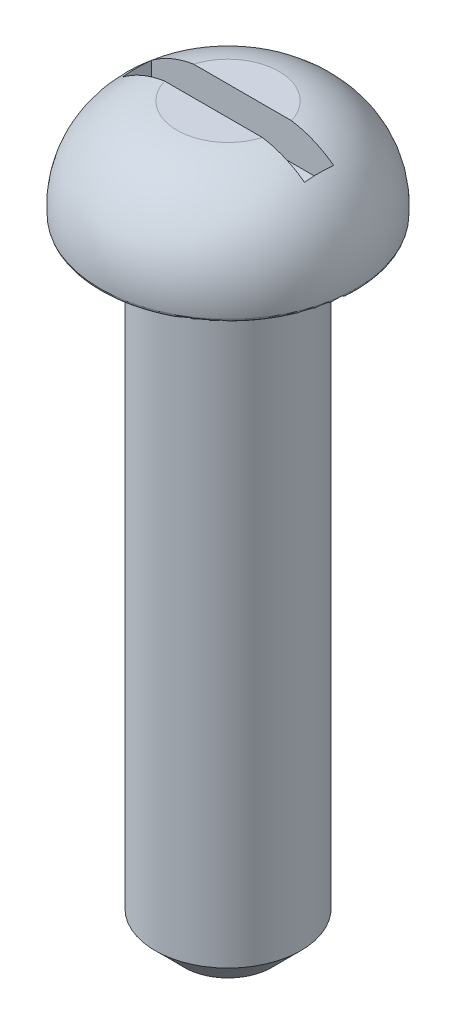
ISO-10303-21;
HEADER;
FILE_DESCRIPTION(('STEP AP214'),'2;1');
FILE_NAME('part.step','',(''),(''),'','','');
FILE_SCHEMA(('AUTOMOTIVE_DESIGN { 1 0 10303 214 1 1 1 1 }'));
ENDSEC;
DATA;
#1=APPLICATION_CONTEXT('core data for automotive mechanical design processes');
#2=APPLICATION_PROTOCOL_DEFINITION('international standard','automotive_design',2000,#1);
#3=PRODUCT_CONTEXT('',#1,'mechanical');
#4=PRODUCT('Part','Part','',(#3));
#5=PRODUCT_RELATED_PRODUCT_CATEGORY('part','',(#4));
#6=PRODUCT_DEFINITION_FORMATION('','',#4);
#7=PRODUCT_DEFINITION_CONTEXT('part definition',#1,'design');
#8=PRODUCT_DEFINITION('design','',#6,#7);
#9=PRODUCT_DEFINITION_SHAPE('','',#8);
#10=(LENGTH_UNIT() NAMED_UNIT(*) SI_UNIT(.MILLI.,.METRE.));
#11=(NAMED_UNIT(*) PLANE_ANGLE_UNIT() SI_UNIT($,.RADIAN.));
#12=(NAMED_UNIT(*) SI_UNIT($,.STERADIAN.) SOLID_ANGLE_UNIT());
#13=UNCERTAINTY_MEASURE_WITH_UNIT(LENGTH_MEASURE(1.E-05),#10,'distance_accuracy_value','');
#14=(GEOMETRIC_REPRESENTATION_CONTEXT(3) GLOBAL_UNCERTAINTY_ASSIGNED_CONTEXT((#13)) GLOBAL_UNIT_ASSIGNED_CONTEXT((#10,
#11,#12)) REPRESENTATION_CONTEXT('',''));
#15=CARTESIAN_POINT('',(0.,0.,0.));
#16=DIRECTION('',(0.,0.,1.));
#17=DIRECTION('',(1.,0.,0.));
#18=AXIS2_PLACEMENT_3D('',#15,#16,#17);
#19=CARTESIAN_POINT('',(0.,20.,0.));
#20=DIRECTION('',(0.,1.,0.));
#21=DIRECTION('',(0.,0.,1.));
#22=AXIS2_PLACEMENT_3D('',#19,#20,#21);
#23=PLANE('',#22);
#24=DIRECTION('',(-1.,0.,0.));
#25=VECTOR('',#24,1.);
#26=CARTESIAN_POINT('',(-2.5,20.,-0.4));
#27=LINE('',#26,#25);
#28=CARTESIAN_POINT('',(1.34164078649987,20.,-0.4));
#29=VERTEX_POINT('',#28);
#30=CARTESIAN_POINT('',(-1.34164078649987,20.,-0.4));
#31=VERTEX_POINT('',#30);
#32=EDGE_CURVE('E105',#29,#31,#27,.T.);
#33=ORIENTED_EDGE('',*,*,#32,.F.);
#34=CARTESIAN_POINT('',(0.,20.,0.));
#35=DIRECTION('',(0.,-1.,0.));
#36=DIRECTION('',(0.,0.,-1.));
#37=AXIS2_PLACEMENT_3D('',#34,#35,#36);
#38=CIRCLE('',#37,1.4);
#39=EDGE_CURVE('E128',#31,#29,#38,.T.);
#40=ORIENTED_EDGE('',*,*,#39,.F.);
#41=EDGE_LOOP('',(#33,#40));
#42=FACE_BOUND('',#41,.T.);
#43=ADVANCED_FACE('F29',(#42),#23,.T.);
#44=CARTESIAN_POINT('',(1.2,0.,0.));
#45=DIRECTION('',(0.,-1.,0.));
#46=DIRECTION('',(0.,0.,-1.));
#47=AXIS2_PLACEMENT_3D('',#44,#45,#46);
#48=PLANE('',#47);
#49=CARTESIAN_POINT('',(0.,0.,0.));
#50=DIRECTION('',(0.,-1.,0.));
#51=DIRECTION('',(0.,0.,-1.));
#52=AXIS2_PLACEMENT_3D('',#49,#50,#51);
#53=CIRCLE('',#52,1.2);
#54=CARTESIAN_POINT('',(0.,0.,-1.2));
#55=VERTEX_POINT('',#54);
#56=EDGE_CURVE('E115',#55,#55,#53,.T.);
#57=ORIENTED_EDGE('',*,*,#56,.T.);
#58=EDGE_LOOP('',(#57));
#59=FACE_BOUND('',#58,.T.);
#60=ADVANCED_FACE('F31',(#59),#48,.T.);
#61=DIRECTION('',(1.,0.,0.));
#62=VECTOR('',#61,1.);
#63=CARTESIAN_POINT('',(-2.5,20.,0.4));
#64=LINE('',#63,#62);
#65=CARTESIAN_POINT('',(-1.34164078649987,20.,0.4));
#66=VERTEX_POINT('',#65);
#67=CARTESIAN_POINT('',(1.34164078649987,20.,0.4));
#68=VERTEX_POINT('',#67);
#69=EDGE_CURVE('E107',#66,#68,#64,.T.);
#70=ORIENTED_EDGE('',*,*,#69,.F.);
#71=EDGE_CURVE('E131',#68,#66,#38,.T.);
#72=ORIENTED_EDGE('',*,*,#71,.F.);
#73=EDGE_LOOP('',(#70,#72));
#74=FACE_BOUND('',#73,.T.);
#75=ADVANCED_FACE('F176',(#74),#23,.T.);
#76=CARTESIAN_POINT('',(0.,17.5125,0.));
#77=DIRECTION('',(0.,-1.,0.));
#78=DIRECTION('',(0.,0.,-1.));
#79=AXIS2_PLACEMENT_3D('',#76,#77,#78);
#80=DEGENERATE_TOROIDAL_SURFACE('',#79,1.,2.5194555463433,.T.);
#81=CARTESIAN_POINT('',(0.,19.9594687881132,-0.4));
#82=CARTESIAN_POINT('',(-0.033838267761427,19.9594721754177,-0.4));
#83=CARTESIAN_POINT('',(-0.0676779641194354,19.9605534690235,-0.4));
#84=CARTESIAN_POINT('',(-0.135250580531708,19.9645271586809,-0.4));
#85=CARTESIAN_POINT('',(-0.16898345897654,19.9674201897673,-0.4));
#86=CARTESIAN_POINT('',(-0.236586103651418,19.9742723387306,-0.4));
#87=CARTESIAN_POINT('',(-0.270455020948054,19.9782392285523,-0.4));
#88=CARTESIAN_POINT('',(-0.338156940635544,19.9864955449094,-0.4));
#89=CARTESIAN_POINT('',(-0.37198993610578,19.9907850250498,-0.4));
#90=CARTESIAN_POINT('',(-0.455604149313947,20.0010989072908,-0.4));
#91=CARTESIAN_POINT('',(-0.505403039900188,20.0069905560453,-0.4));
#92=CARTESIAN_POINT('',(-0.605160163724098,20.0172184164192,-0.4));
#93=CARTESIAN_POINT('',(-0.655118370099626,20.021554877577,-0.4));
#94=CARTESIAN_POINT('',(-0.755158183029392,20.0281116283189,-0.4));
#95=CARTESIAN_POINT('',(-0.805239724114253,20.0303328670776,-0.4));
#96=CARTESIAN_POINT('',(-0.905451481224645,20.0323446383411,-0.4));
#97=CARTESIAN_POINT('',(-0.955581698913415,20.0321350846395,-0.4));
#98=CARTESIAN_POINT('',(-1.10519744004029,20.0275826093243,-0.4));
#99=CARTESIAN_POINT('',(-1.20460157264622,20.0193672135559,-0.4));
#100=CARTESIAN_POINT('',(-1.40192321413768,19.9918916724499,-0.4));
#101=CARTESIAN_POINT('',(-1.49984015178237,19.9726273880546,-0.4));
#102=CARTESIAN_POINT('',(-1.66562418126213,19.9299930807012,-0.4));
#103=CARTESIAN_POINT('',(-1.73418957692369,19.9093063038867,-0.4));
#104=CARTESIAN_POINT('',(-1.86931661924559,19.8623062089933,-0.4));
#105=CARTESIAN_POINT('',(-1.93587915382989,19.8359954273999,-0.4));
#106=CARTESIAN_POINT('',(-2.13232230422446,19.7485950153914,-0.4));
#107=CARTESIAN_POINT('',(-2.25860062073281,19.6791290253755,-0.4));
#108=CARTESIAN_POINT('',(-2.49744991030645,19.5198455931525,-0.4));
#109=CARTESIAN_POINT('',(-2.61002524010937,19.4300346455554,-0.4));
#110=CARTESIAN_POINT('',(-2.81813579673432,19.2326675848493,-0.4));
#111=CARTESIAN_POINT('',(-2.9136919776501,19.125133611118,-0.4));
#112=CARTESIAN_POINT('',(-3.084020861249,18.8967637441041,-0.4));
#113=CARTESIAN_POINT('',(-3.15903353936495,18.7761066918437,-0.4));
#114=CARTESIAN_POINT('',(-3.28766382741801,18.5238219313858,-0.4));
#115=CARTESIAN_POINT('',(-3.34127386321256,18.3921903593208,-0.4));
#116=CARTESIAN_POINT('',(-3.42530915106019,18.1223801199838,-0.4));
#117=CARTESIAN_POINT('',(-3.45583823753319,17.984233780706,-0.4));
#118=CARTESIAN_POINT('',(-3.49323058953172,17.7047946739299,-0.4));
#119=CARTESIAN_POINT('',(-3.50009745955316,17.5635023889581,-0.4));
#120=CARTESIAN_POINT('',(-3.48998437740454,17.2819727914454,-0.4));
#121=CARTESIAN_POINT('',(-3.47303776304047,17.1417342798249,-0.4));
#122=CARTESIAN_POINT('',(-3.41583978349254,16.8660706381648,-0.4));
#123=CARTESIAN_POINT('',(-3.37558477651419,16.7306462638152,-0.4));
#124=CARTESIAN_POINT('',(-3.27291000213663,16.4684418568154,-0.4));
#125=CARTESIAN_POINT('',(-3.21048499893456,16.3416638745886,-0.4));
#126=CARTESIAN_POINT('',(-3.0652995823894,16.1004253875458,-0.4));
#127=CARTESIAN_POINT('',(-2.98254846845238,15.9859592842568,-0.4));
#128=CARTESIAN_POINT('',(-2.79895170451084,15.772356227364,-0.4));
#129=CARTESIAN_POINT('',(-2.69808464515238,15.6732376723482,-0.4));
#130=CARTESIAN_POINT('',(-2.48109536029556,15.4931192895068,-0.4));
#131=CARTESIAN_POINT('',(-2.36495283010316,15.4121439725998,-0.4));
#132=CARTESIAN_POINT('',(-2.12003686955878,15.2702055463965,-0.4));
#133=CARTESIAN_POINT('',(-1.99119324147536,15.2093628035941,-0.4));
#134=CARTESIAN_POINT('',(-1.79208455400501,15.1348165249818,-0.4));
#135=CARTESIAN_POINT('',(-1.72482351761208,15.112770190514,-0.4));
#136=CARTESIAN_POINT('',(-1.58871399977606,15.074248069245,-0.4));
#137=CARTESIAN_POINT('',(-1.51986566275127,15.0577717777811,-0.4));
#138=CARTESIAN_POINT('',(-1.37991833917445,15.0301913167248,-0.4));
#139=CARTESIAN_POINT('',(-1.30880096493828,15.0191810623686,-0.4));
#140=CARTESIAN_POINT('',(-1.16590883388619,15.0028540264086,-0.4));
#141=CARTESIAN_POINT('',(-1.09413397404904,14.9975381529959,-0.4));
#142=CARTESIAN_POINT('',(-0.95018470929067,14.9923360188387,-0.4));
#143=CARTESIAN_POINT('',(-0.878009750752938,14.9924659131582,-0.4));
#144=CARTESIAN_POINT('',(-0.733868359233083,14.9976141000356,-0.4));
#145=CARTESIAN_POINT('',(-0.661901885229667,15.0026313546615,-0.4));
#146=CARTESIAN_POINT('',(-0.527362844770218,15.0154201147344,-0.4));
#147=CARTESIAN_POINT('',(-0.464745964796632,15.0227664151523,-0.4));
#148=CARTESIAN_POINT('',(-0.370921074758584,15.0343512736872,-0.4));
#149=CARTESIAN_POINT('',(-0.339674021780256,15.0383056106516,-0.4));
#150=CARTESIAN_POINT('',(-0.277140745039577,15.0459577789511,-0.4));
#151=CARTESIAN_POINT('',(-0.245854514991187,15.0496555616753,-0.4));
#152=CARTESIAN_POINT('',(-0.183022337538648,15.0562464425247,-0.4));
#153=CARTESIAN_POINT('',(-0.151475896905264,15.0591351211382,-0.4));
#154=CARTESIAN_POINT('',(-0.0882845194117602,15.0634407062094,-0.4));
#155=CARTESIAN_POINT('',(-0.0566396201019189,15.0648581178138,-0.4));
#156=CARTESIAN_POINT('',(0.00670900055783423,15.0658228744264,-0.4));
#157=CARTESIAN_POINT('',(0.0384127491098334,15.0653686014411,-0.4));
#158=CARTESIAN_POINT('',(0.101755848962479,15.0627217036994,-0.4));
#159=CARTESIAN_POINT('',(0.133395161231609,15.0605282297223,-0.4));
#160=CARTESIAN_POINT('',(0.197075668927695,15.0549206280494,-0.4));
#161=CARTESIAN_POINT('',(0.229115032813018,15.0514872303989,-0.4));
#162=CARTESIAN_POINT('',(0.293132454280715,15.0440721569489,-0.4));
#163=CARTESIAN_POINT('',(0.325110499752554,15.0400903822904,-0.4));
#164=CARTESIAN_POINT('',(0.389068757237886,15.032113224633,-0.4));
#165=CARTESIAN_POINT('',(0.421048969104994,15.0281178401912,-0.4));
#166=CARTESIAN_POINT('',(0.485051815385007,15.0204868263651,-0.4));
#167=CARTESIAN_POINT('',(0.517074449026821,15.0168511905303,-0.4));
#168=CARTESIAN_POINT('',(0.613199905067878,15.0068908859735,-0.4));
#169=CARTESIAN_POINT('',(0.677408550694873,15.0015058987141,-0.4));
#170=CARTESIAN_POINT('',(0.80604095698653,14.9944125710688,-0.4));
#171=CARTESIAN_POINT('',(0.870464712950283,14.9927041508571,-0.4));
#172=CARTESIAN_POINT('',(0.998362213092589,14.9934918122463,-0.4));
#173=CARTESIAN_POINT('',(1.06183615678955,14.9959271498236,-0.4));
#174=CARTESIAN_POINT('',(1.18845961005121,15.0051429318533,-0.4));
#175=CARTESIAN_POINT('',(1.25160909489982,15.0119237025194,-0.4));
#176=CARTESIAN_POINT('',(1.44046174579123,15.0390588425836,-0.4));
#177=CARTESIAN_POINT('',(1.56529661737748,15.0662059685067,-0.4));
#178=CARTESIAN_POINT('',(1.75532938071435,15.1225098666057,-0.4));
#179=CARTESIAN_POINT('',(1.82244963264302,15.1454497391749,-0.400000000000001));
#180=CARTESIAN_POINT('',(1.9544668245481,15.1967759205072,-0.400000000000001));
#181=CARTESIAN_POINT('',(2.0193672489669,15.2251531837482,-0.400000000000001));
#182=CARTESIAN_POINT('',(2.14746610091274,15.287655872903,-0.400000000000001));
#183=CARTESIAN_POINT('',(2.2106280791609,15.3218560714777,-0.400000000000001));
#184=CARTESIAN_POINT('',(2.33384141088278,15.3954981556499,-0.400000000000001));
#185=CARTESIAN_POINT('',(2.39389112687907,15.4349427623866,-0.400000000000001));
#186=CARTESIAN_POINT('',(2.56822105293428,15.5604414895362,-0.400000000000001));
#187=CARTESIAN_POINT('',(2.67727417342556,15.6539498739746,-0.400000000000001));
#188=CARTESIAN_POINT('',(2.87731664505904,15.8575381230657,-0.400000000000001));
#189=CARTESIAN_POINT('',(2.96839942775861,15.967526745611,-0.400000000000001));
#190=CARTESIAN_POINT('',(3.13011034367072,16.2005805767337,-0.400000000000001));
#191=CARTESIAN_POINT('',(3.2008690104347,16.3235550656091,-0.400000000000001));
#192=CARTESIAN_POINT('',(3.32076250094825,16.5798864015786,-0.400000000000001));
#193=CARTESIAN_POINT('',(3.36985981264247,16.7132607924852,-0.400000000000001));
#194=CARTESIAN_POINT('',(3.44466082174416,16.9857648809142,-0.400000000000001));
#195=CARTESIAN_POINT('',(3.47046942013737,17.1248657895259,-0.400000000000001));
#196=CARTESIAN_POINT('',(3.49832209574621,17.4053506959011,-0.400000000000001));
#197=CARTESIAN_POINT('',(3.50037915256109,17.5467334044125,-0.400000000000001));
#198=CARTESIAN_POINT('',(3.48071400899756,17.827680796085,-0.400000000000001));
#199=CARTESIAN_POINT('',(3.45901751439648,17.9672472794955,-0.400000000000001));
#200=CARTESIAN_POINT('',(3.39249967383479,18.2407968712602,-0.400000000000001));
#201=CARTESIAN_POINT('',(3.34767190795042,18.3747784183909,-0.400000000000001));
#202=CARTESIAN_POINT('',(3.2361536208201,18.6333685749116,-0.400000000000001));
#203=CARTESIAN_POINT('',(3.16945508114511,18.7579737260251,-0.400000000000001));
#204=CARTESIAN_POINT('',(3.01616115015904,18.9941704376459,-0.400000000000001));
#205=CARTESIAN_POINT('',(2.92957716226703,19.1057694015433,-0.400000000000001));
#206=CARTESIAN_POINT('',(2.73884400908251,19.3130500055761,-0.400000000000001));
#207=CARTESIAN_POINT('',(2.63467263893207,19.4087112164015,-0.400000000000001));
#208=CARTESIAN_POINT('',(2.41166340004833,19.5814542600167,-0.400000000000001));
#209=CARTESIAN_POINT('',(2.29280072738464,19.6585040042624,-0.400000000000001));
#210=CARTESIAN_POINT('',(2.04300308130581,19.7922605207593,-0.400000000000001));
#211=CARTESIAN_POINT('',(1.9119902448074,19.8488227998933,-0.4));
#212=CARTESIAN_POINT('',(1.71029562555841,19.9167355419974,-0.4));
#213=CARTESIAN_POINT('',(1.64233860502261,19.9365291975628,-0.4));
#214=CARTESIAN_POINT('',(1.50500335369698,19.970535819594,-0.4));
#215=CARTESIAN_POINT('',(1.43562462691051,19.9847468022932,-0.4));
#216=CARTESIAN_POINT('',(1.2783891816424,20.0104556218676,-0.4));
#217=CARTESIAN_POINT('',(1.19027247123467,20.0203729092839,-0.4));
#218=CARTESIAN_POINT('',(1.01355864413965,20.031745217942,-0.4));
#219=CARTESIAN_POINT('',(0.924961815219316,20.0332048448398,-0.4));
#220=CARTESIAN_POINT('',(0.791965647083487,20.0297457589619,-0.4));
#221=CARTESIAN_POINT('',(0.747467524576748,20.0276346462116,-0.4));
#222=CARTESIAN_POINT('',(0.658580235401713,20.021753448913,-0.4));
#223=CARTESIAN_POINT('',(0.61419107013105,20.0179833431949,-0.4));
#224=CARTESIAN_POINT('',(0.525521437051818,20.0091681976184,-0.4));
#225=CARTESIAN_POINT('',(0.481241040864897,20.004122470548,-0.4));
#226=CARTESIAN_POINT('',(0.392755822811418,19.9934177415786,-0.4));
#227=CARTESIAN_POINT('',(0.348551004111989,19.9877587145892,-0.4));
#228=CARTESIAN_POINT('',(0.278970443467475,19.9792802111881,-0.4));
#229=CARTESIAN_POINT('',(0.253617379606739,19.976280354131,-0.4));
#230=CARTESIAN_POINT('',(0.202862030439123,19.9707658833481,-0.4));
#231=CARTESIAN_POINT('',(0.177459757037157,19.9682511642246,-0.4));
#232=CARTESIAN_POINT('',(0.126738568217447,19.9640518042722,-0.4));
#233=CARTESIAN_POINT('',(0.10142008431906,19.9623622119908,-0.4));
#234=CARTESIAN_POINT('',(0.0507346632318588,19.9600695076987,-0.4));
#235=CARTESIAN_POINT('',(0.0253677330615122,19.9594662487327,-0.4));
#236=CARTESIAN_POINT('',(0.,19.9594687881132,-0.4));
#237=B_SPLINE_CURVE_WITH_KNOTS('',3,(#81,#82,#83,#84,#85,#86,#87,#88,#89,#90,#91,#92,#93,#94,
#95,#96,#97,#98,#99,#100,#101,#102,#103,#104,#105,#106,#107,#108,#109,#110,#111,#112,#113,#114,
#115,#116,#117,#118,#119,#120,#121,#122,#123,#124,#125,#126,#127,#128,#129,#130,#131,#132,#133,
#134,#135,#136,#137,#138,#139,#140,#141,#142,#143,#144,#145,#146,#147,#148,#149,#150,#151,#152,
#153,#154,#155,#156,#157,#158,#159,#160,#161,#162,#163,#164,#165,#166,#167,#168,#169,#170,#171,
#172,#173,#174,#175,#176,#177,#178,#179,#180,#181,#182,#183,#184,#185,#186,#187,#188,#189,#190,
#191,#192,#193,#194,#195,#196,#197,#198,#199,#200,#201,#202,#203,#204,#205,#206,#207,#208,#209,
#210,#211,#212,#213,#214,#215,#216,#217,#218,#219,#220,#221,#222,#223,#224,#225,#226,#227,#228,
#229,#230,#231,#232,#233,#234,#235,#236),.UNSPECIFIED.,.T.,.F.,(4,2,2,2,2,2,2,2,2,2,2,2,2,2,2,2,
2,2,2,2,2,2,2,2,2,2,2,2,2,2,2,2,2,2,2,2,2,2,2,2,2,2,2,2,2,2,2,2,2,2,2,2,2,2,2,2,2,2,2,2,2,2,2,2,
2,2,2,2,2,2,2,2,2,2,2,2,2,4),(0.,0.101504820932103,0.203045240398578,0.305341160156973,
0.407654116223659,0.558081783931965,0.708485303870073,0.8588213006085,1.00916262892524,
1.30776882315044,1.60648695227951,1.82109723915609,2.03561093798814,2.4657326568493,
2.89571726330221,3.32516875395587,3.74936604809479,4.17371332786318,4.5961400441297,
5.01850240874495,5.44027407379522,5.8621116558905,6.28404892806824,6.70579351796423,
7.12803984347598,7.55085321578287,7.97615061383829,8.18830163157114,8.40043342262915,
8.6160936898064,8.83178834730523,9.04812291583578,9.26441155126527,9.45352775460854,
9.54801820378474,9.64252650798969,9.73754139533282,9.83252364934071,9.92758802877956,
10.022698855065,10.1193563532496,10.2160312993006,10.3127168351883,10.4094006371196,
10.6026220243656,10.7958392163339,10.9862483442131,11.1766717678777,11.5583291965066,
11.7709265896662,11.9831733338554,12.1983855488727,12.4137098689357,12.8424067104954,
13.2688122625346,13.692414601143,14.1167476610478,14.5391596860364,14.9613408629157,
15.3830656121491,15.8049074711653,16.2269041622917,16.6486594586918,17.0709512775254,
17.4939660660107,17.9199087118788,18.132056911754,18.3442804290728,18.609863453294,
18.8753018395141,19.008919354105,19.1425385737906,19.2762299317646,19.4099267612036,
19.4865147484735,19.5630860779915,19.6391920897656,19.7152878054215),.UNSPECIFIED.);
#238=CARTESIAN_POINT('',(2.5,19.5128129281362,-0.400000000000001));
#239=VERTEX_POINT('',#238);
#240=EDGE_CURVE('E11',#239,#29,#237,.T.);
#241=ORIENTED_EDGE('',*,*,#240,.F.);
#242=CARTESIAN_POINT('',(2.5,19.5367668425877,0.));
#243=CARTESIAN_POINT('',(2.5,19.5367670015249,-0.0915002648169019));
#244=CARTESIAN_POINT('',(2.5,19.5330519280067,-0.183007797475908));
#245=CARTESIAN_POINT('',(2.5,19.5180908020495,-0.365383970362098));
#246=CARTESIAN_POINT('',(2.5,19.5068432122217,-0.456252476337135));
#247=CARTESIAN_POINT('',(2.5,19.461362155303,-0.72654482251558));
#248=CARTESIAN_POINT('',(2.5,19.4153942264796,-0.904280473858293));
#249=CARTESIAN_POINT('',(2.5,19.3069506191006,-1.19748232639554));
#250=CARTESIAN_POINT('',(2.5,19.2530376109683,-1.31614405769195));
#251=CARTESIAN_POINT('',(2.5,19.126656167764,-1.54325305912053));
#252=CARTESIAN_POINT('',(2.5,19.0541987569766,-1.65170634576009));
#253=CARTESIAN_POINT('',(2.5,18.8902299193953,-1.8548043569158));
#254=CARTESIAN_POINT('',(2.5,18.7985618626584,-1.94932395558131));
#255=CARTESIAN_POINT('',(2.5,18.5983729261488,-2.11853619772126));
#256=CARTESIAN_POINT('',(2.5,18.4898632613297,-2.19324194635525));
#257=CARTESIAN_POINT('',(2.5,18.275575093763,-2.3097698044652));
#258=CARTESIAN_POINT('',(2.5,18.1714856021864,-2.35470691354324));
#259=CARTESIAN_POINT('',(2.5,17.9567699842453,-2.42442000934846));
#260=CARTESIAN_POINT('',(2.5,17.8461483261894,-2.44920961041039));
#261=CARTESIAN_POINT('',(2.5,17.6327053910413,-2.47608357714888));
#262=CARTESIAN_POINT('',(2.5,17.5301195153304,-2.48007087085806));
#263=CARTESIAN_POINT('',(2.5,17.3258092703255,-2.47031652720578));
#264=CARTESIAN_POINT('',(2.5,17.2240846925092,-2.45657931214316));
#265=CARTESIAN_POINT('',(2.5,17.0268160142359,-2.41248488240354));
#266=CARTESIAN_POINT('',(2.5,16.931183203771,-2.38252153712198));
#267=CARTESIAN_POINT('',(2.5,16.7460931871743,-2.30742528464294));
#268=CARTESIAN_POINT('',(2.5,16.6566363629631,-2.26229144031843));
#269=CARTESIAN_POINT('',(2.5,16.4833361297419,-2.15692413643585));
#270=CARTESIAN_POINT('',(2.5,16.3997500402724,-2.09626890754031));
#271=CARTESIAN_POINT('',(2.5,16.2429648945198,-1.96281078422355));
#272=CARTESIAN_POINT('',(2.5,16.1697680067488,-1.89000536060222));
#273=CARTESIAN_POINT('',(2.5,16.0289264329146,-1.72790867535516));
#274=CARTESIAN_POINT('',(2.5,15.9622958758047,-1.63773913873686));
#275=CARTESIAN_POINT('',(2.5,15.8427839181365,-1.44874918190837));
#276=CARTESIAN_POINT('',(2.5,15.7899107052323,-1.34992365665206));
#277=CARTESIAN_POINT('',(2.5,15.6776441076254,-1.10212490845805));
#278=CARTESIAN_POINT('',(2.5,15.6253136882517,-0.949942139465327));
#279=CARTESIAN_POINT('',(2.5,15.5459322266466,-0.639039136176455));
#280=CARTESIAN_POINT('',(2.5,15.5189387998828,-0.480304854809008));
#281=CARTESIAN_POINT('',(2.5,15.4879004512649,-0.157865091630425));
#282=CARTESIAN_POINT('',(2.5,15.4842658381049,0.00587876292039937));
#283=CARTESIAN_POINT('',(2.5,15.5006814189312,0.332122170327459));
#284=CARTESIAN_POINT('',(2.5,15.520714470928,0.494622538061391));
#285=CARTESIAN_POINT('',(2.5,15.5827239177504,0.797277045413253));
#286=CARTESIAN_POINT('',(2.5,15.6221064017617,0.937953830788708));
#287=CARTESIAN_POINT('',(2.5,15.7230465774401,1.21111704379188));
#288=CARTESIAN_POINT('',(2.5,15.7845703220912,1.34361564786348));
#289=CARTESIAN_POINT('',(2.5,15.9177233191766,1.57250786917698));
#290=CARTESIAN_POINT('',(2.5,15.985543898468,1.67110875342554));
#291=CARTESIAN_POINT('',(2.5,16.1366125292409,1.85580706618106));
#292=CARTESIAN_POINT('',(2.5,16.2198577567511,1.94190677828607));
#293=CARTESIAN_POINT('',(2.5,16.4009748654164,2.09840875730939));
#294=CARTESIAN_POINT('',(2.5,16.4989323028123,2.16871276558768));
#295=CARTESIAN_POINT('',(2.5,16.7064469321812,2.28944621439156));
#296=CARTESIAN_POINT('',(2.5,16.8159983238678,2.33988553385618));
#297=CARTESIAN_POINT('',(2.5,17.0304039926848,2.41388256230386));
#298=CARTESIAN_POINT('',(2.5,17.1344531251417,2.43978388133006));
#299=CARTESIAN_POINT('',(2.5,17.3454957286838,2.47254011541879));
#300=CARTESIAN_POINT('',(2.5,17.4524878924767,2.47940335349104));
#301=CARTESIAN_POINT('',(2.5,17.6596624673535,2.47395032082968));
#302=CARTESIAN_POINT('',(2.5,17.7598758808131,2.46273645676311));
#303=CARTESIAN_POINT('',(2.5,17.9569791779968,2.42364412292458));
#304=CARTESIAN_POINT('',(2.5,18.053869426513,2.39576748849706));
#305=CARTESIAN_POINT('',(2.5,18.2418158126943,2.32442672746202));
#306=CARTESIAN_POINT('',(2.5,18.3328658945149,2.2809467196809));
#307=CARTESIAN_POINT('',(2.5,18.5068611882592,2.18005488429901));
#308=CARTESIAN_POINT('',(2.5,18.5898051134108,2.12264084983198));
#309=CARTESIAN_POINT('',(2.5,18.7501522532948,1.99249036295088));
#310=CARTESIAN_POINT('',(2.5,18.8270218533704,1.91909863435174));
#311=CARTESIAN_POINT('',(2.5,18.9688300237409,1.76162591724045));
#312=CARTESIAN_POINT('',(2.5,19.033765096437,1.67754180733593));
#313=CARTESIAN_POINT('',(2.5,19.1579498910983,1.49117286112959));
#314=CARTESIAN_POINT('',(2.5,19.2157195955857,1.38790535829524));
#315=CARTESIAN_POINT('',(2.5,19.3162174418205,1.1743543810094));
#316=CARTESIAN_POINT('',(2.5,19.3589365686593,1.06406674821158));
#317=CARTESIAN_POINT('',(2.5,19.4430915918001,0.798248126082746));
#318=CARTESIAN_POINT('',(2.5,19.4784756070002,0.640780050388826));
#319=CARTESIAN_POINT('',(2.5,19.5135874587563,0.402013236836231));
#320=CARTESIAN_POINT('',(2.5,19.52229683123,0.321862262979064));
#321=CARTESIAN_POINT('',(2.5,19.5338856326612,0.16114265535465));
#322=CARTESIAN_POINT('',(2.5,19.5367667026293,0.0805741455554353));
#323=CARTESIAN_POINT('',(2.5,19.5367668425877,0.));
#324=B_SPLINE_CURVE_WITH_KNOTS('',3,(#242,#243,#244,#245,#246,#247,#248,#249,#250,#251,#252,
#253,#254,#255,#256,#257,#258,#259,#260,#261,#262,#263,#264,#265,#266,#267,#268,#269,#270,#271,
#272,#273,#274,#275,#276,#277,#278,#279,#280,#281,#282,#283,#284,#285,#286,#287,#288,#289,#290,
#291,#292,#293,#294,#295,#296,#297,#298,#299,#300,#301,#302,#303,#304,#305,#306,#307,#308,#309,
#310,#311,#312,#313,#314,#315,#316,#317,#318,#319,#320,#321,#322,#323),.UNSPECIFIED.,.T.,.F.,(4,
2,2,2,2,2,2,2,2,2,2,2,2,2,2,2,2,2,2,2,2,2,2,2,2,2,2,2,2,2,2,2,2,2,2,2,2,2,2,2,4),(0.,
0.27441501458653,0.548886054437859,1.09597501657236,1.48555741429442,1.87490874869223,
2.26756751275134,2.65996591542711,2.99822121841734,3.33624776067343,3.64273043744199,
3.94913666098119,4.24841843240524,4.54771869475693,4.85622567133241,5.16479694740183,
5.49982491015698,5.83505181036272,6.31520170952834,6.79644082691913,7.28611055366777,
7.77542584029954,8.21207460177579,8.64805672506248,9.00561192257923,9.36310172283597,
9.72275727557959,10.0822337409247,10.4022372415518,10.722100821967,11.0231846135131,
11.324235247868,11.6255931658266,11.9269988439299,12.2445251339687,12.5621443321505,
12.9157856276996,13.269638386591,13.7514678815871,13.9931828479188,14.2348297477626),.UNSPECIFIED.);
#325=CARTESIAN_POINT('',(2.5,19.5128129281341,0.4));
#326=VERTEX_POINT('',#325);
#327=EDGE_CURVE('E33',#326,#239,#324,.T.);
#328=ORIENTED_EDGE('',*,*,#327,.F.);
#329=CARTESIAN_POINT('',(0.,19.9594687881132,0.4));
#330=CARTESIAN_POINT('',(0.0338382677614266,19.9594721754177,0.4));
#331=CARTESIAN_POINT('',(0.0676779641194351,19.9605534690235,0.4));
#332=CARTESIAN_POINT('',(0.135250580531707,19.9645271586809,0.4));
#333=CARTESIAN_POINT('',(0.16898345897654,19.9674201897673,0.4));
#334=CARTESIAN_POINT('',(0.236586103651418,19.9742723387306,0.4));
#335=CARTESIAN_POINT('',(0.270455020948054,19.9782392285523,0.4));
#336=CARTESIAN_POINT('',(0.338156940635543,19.9864955449094,0.4));
#337=CARTESIAN_POINT('',(0.371989936105779,19.9907850250498,0.4));
#338=CARTESIAN_POINT('',(0.455604149313946,20.0010989072908,0.4));
#339=CARTESIAN_POINT('',(0.505403039900187,20.0069905560453,0.4));
#340=CARTESIAN_POINT('',(0.605160163724097,20.0172184164192,0.4));
#341=CARTESIAN_POINT('',(0.655118370099625,20.021554877577,0.4));
#342=CARTESIAN_POINT('',(0.755158183029391,20.0281116283189,0.4));
#343=CARTESIAN_POINT('',(0.805239724114252,20.0303328670776,0.4));
#344=CARTESIAN_POINT('',(0.905451481224645,20.0323446383411,0.4));
#345=CARTESIAN_POINT('',(0.955581698913415,20.0321350846395,0.4));
#346=CARTESIAN_POINT('',(1.10519744004029,20.0275826093243,0.4));
#347=CARTESIAN_POINT('',(1.20460157264622,20.0193672135559,0.4));
#348=CARTESIAN_POINT('',(1.40192321413768,19.9918916724499,0.4));
#349=CARTESIAN_POINT('',(1.49984015178237,19.9726273880546,0.4));
#350=CARTESIAN_POINT('',(1.66562418126213,19.9299930807012,0.4));
#351=CARTESIAN_POINT('',(1.73418957692369,19.9093063038867,0.4));
#352=CARTESIAN_POINT('',(1.86931661924559,19.8623062089933,0.4));
#353=CARTESIAN_POINT('',(1.93587915382989,19.8359954273999,0.4));
#354=CARTESIAN_POINT('',(2.13232230422446,19.7485950153914,0.4));
#355=CARTESIAN_POINT('',(2.25860062073281,19.6791290253755,0.4));
#356=CARTESIAN_POINT('',(2.49744991030645,19.5198455931525,0.4));
#357=CARTESIAN_POINT('',(2.61002524010937,19.4300346455554,0.4));
#358=CARTESIAN_POINT('',(2.81813579673432,19.2326675848493,0.4));
#359=CARTESIAN_POINT('',(2.9136919776501,19.125133611118,0.4));
#360=CARTESIAN_POINT('',(3.084020861249,18.8967637441041,0.4));
#361=CARTESIAN_POINT('',(3.15903353936495,18.7761066918437,0.4));
#362=CARTESIAN_POINT('',(3.28766382741802,18.5238219313858,0.4));
#363=CARTESIAN_POINT('',(3.34127386321256,18.3921903593208,0.4));
#364=CARTESIAN_POINT('',(3.42530915106019,18.1223801199838,0.4));
#365=CARTESIAN_POINT('',(3.45583823753319,17.984233780706,0.399999999999999));
#366=CARTESIAN_POINT('',(3.49323058953172,17.7047946739299,0.399999999999999));
#367=CARTESIAN_POINT('',(3.50009745955316,17.5635023889581,0.399999999999999));
#368=CARTESIAN_POINT('',(3.48998437740454,17.2819727914454,0.399999999999999));
#369=CARTESIAN_POINT('',(3.47303776304047,17.1417342798249,0.4));
#370=CARTESIAN_POINT('',(3.41583978349254,16.8660706381648,0.4));
#371=CARTESIAN_POINT('',(3.37558477651419,16.7306462638152,0.4));
#372=CARTESIAN_POINT('',(3.27291000213663,16.4684418568154,0.4));
#373=CARTESIAN_POINT('',(3.21048499893456,16.3416638745886,0.4));
#374=CARTESIAN_POINT('',(3.0652995823894,16.1004253875458,0.4));
#375=CARTESIAN_POINT('',(2.98254846845238,15.9859592842568,0.4));
#376=CARTESIAN_POINT('',(2.79895170451084,15.772356227364,0.4));
#377=CARTESIAN_POINT('',(2.69808464515238,15.6732376723482,0.4));
#378=CARTESIAN_POINT('',(2.48109536029556,15.4931192895068,0.4));
#379=CARTESIAN_POINT('',(2.36495283010316,15.4121439725998,0.4));
#380=CARTESIAN_POINT('',(2.12003686955878,15.2702055463965,0.4));
#381=CARTESIAN_POINT('',(1.99119324147536,15.2093628035941,0.4));
#382=CARTESIAN_POINT('',(1.792084554005,15.1348165249818,0.4));
#383=CARTESIAN_POINT('',(1.72482351761208,15.112770190514,0.4));
#384=CARTESIAN_POINT('',(1.58871399977606,15.074248069245,0.4));
#385=CARTESIAN_POINT('',(1.51986566275127,15.0577717777811,0.4));
#386=CARTESIAN_POINT('',(1.37991833917445,15.0301913167248,0.4));
#387=CARTESIAN_POINT('',(1.30880096493828,15.0191810623686,0.4));
#388=CARTESIAN_POINT('',(1.16590883388619,15.0028540264086,0.4));
#389=CARTESIAN_POINT('',(1.09413397404904,14.9975381529959,0.4));
#390=CARTESIAN_POINT('',(0.950184709290666,14.9923360188387,0.4));
#391=CARTESIAN_POINT('',(0.878009750752935,14.9924659131582,0.4));
#392=CARTESIAN_POINT('',(0.73386835923308,14.9976141000356,0.4));
#393=CARTESIAN_POINT('',(0.661901885229665,15.0026313546615,0.4));
#394=CARTESIAN_POINT('',(0.527362844770217,15.0154201147344,0.4));
#395=CARTESIAN_POINT('',(0.46474596479663,15.0227664151523,0.4));
#396=CARTESIAN_POINT('',(0.370921074758583,15.0343512736872,0.4));
#397=CARTESIAN_POINT('',(0.339674021780254,15.0383056106516,0.4));
#398=CARTESIAN_POINT('',(0.277140745039576,15.0459577789511,0.4));
#399=CARTESIAN_POINT('',(0.245854514991185,15.0496555616753,0.4));
#400=CARTESIAN_POINT('',(0.183022337538646,15.0562464425247,0.4));
#401=CARTESIAN_POINT('',(0.151475896905262,15.0591351211382,0.4));
#402=CARTESIAN_POINT('',(0.0882845194117588,15.0634407062094,0.4));
#403=CARTESIAN_POINT('',(0.0566396201019175,15.0648581178138,0.4));
#404=CARTESIAN_POINT('',(-0.00670900055783532,15.0658228744264,0.4));
#405=CARTESIAN_POINT('',(-0.0384127491098342,15.0653686014411,0.4));
#406=CARTESIAN_POINT('',(-0.10175584896248,15.0627217036994,0.4));
#407=CARTESIAN_POINT('',(-0.13339516123161,15.0605282297223,0.4));
#408=CARTESIAN_POINT('',(-0.197075668927697,15.0549206280494,0.4));
#409=CARTESIAN_POINT('',(-0.229115032813021,15.0514872303989,0.4));
#410=CARTESIAN_POINT('',(-0.293132454280717,15.0440721569489,0.4));
#411=CARTESIAN_POINT('',(-0.325110499752556,15.0400903822904,0.4));
#412=CARTESIAN_POINT('',(-0.389068757237887,15.032113224633,0.4));
#413=CARTESIAN_POINT('',(-0.421048969104996,15.0281178401912,0.4));
#414=CARTESIAN_POINT('',(-0.485051815385008,15.0204868263651,0.4));
#415=CARTESIAN_POINT('',(-0.517074449026821,15.0168511905303,0.4));
#416=CARTESIAN_POINT('',(-0.613199905067878,15.0068908859735,0.4));
#417=CARTESIAN_POINT('',(-0.677408550694873,15.0015058987141,0.4));
#418=CARTESIAN_POINT('',(-0.80604095698653,14.9944125710688,0.4));
#419=CARTESIAN_POINT('',(-0.870464712950283,14.9927041508571,0.4));
#420=CARTESIAN_POINT('',(-0.998362213092589,14.9934918122463,0.4));
#421=CARTESIAN_POINT('',(-1.06183615678955,14.9959271498236,0.4));
#422=CARTESIAN_POINT('',(-1.18845961005121,15.0051429318533,0.4));
#423=CARTESIAN_POINT('',(-1.25160909489982,15.0119237025194,0.4));
#424=CARTESIAN_POINT('',(-1.44046174579123,15.0390588425836,0.4));
#425=CARTESIAN_POINT('',(-1.56529661737748,15.0662059685067,0.4));
#426=CARTESIAN_POINT('',(-1.75532938071435,15.1225098666057,0.4));
#427=CARTESIAN_POINT('',(-1.82244963264302,15.1454497391749,0.4));
#428=CARTESIAN_POINT('',(-1.9544668245481,15.1967759205072,0.4));
#429=CARTESIAN_POINT('',(-2.0193672489669,15.2251531837482,0.4));
#430=CARTESIAN_POINT('',(-2.14746610091274,15.287655872903,0.4));
#431=CARTESIAN_POINT('',(-2.2106280791609,15.3218560714777,0.4));
#432=CARTESIAN_POINT('',(-2.33384141088278,15.3954981556499,0.4));
#433=CARTESIAN_POINT('',(-2.39389112687907,15.4349427623866,0.4));
#434=CARTESIAN_POINT('',(-2.56822105293428,15.5604414895362,0.4));
#435=CARTESIAN_POINT('',(-2.67727417342556,15.6539498739746,0.4));
#436=CARTESIAN_POINT('',(-2.87731664505904,15.8575381230657,0.4));
#437=CARTESIAN_POINT('',(-2.96839942775862,15.967526745611,0.4));
#438=CARTESIAN_POINT('',(-3.13011034367072,16.2005805767337,0.4));
#439=CARTESIAN_POINT('',(-3.2008690104347,16.3235550656091,0.4));
#440=CARTESIAN_POINT('',(-3.32076250094825,16.5798864015786,0.4));
#441=CARTESIAN_POINT('',(-3.36985981264247,16.7132607924853,0.4));
#442=CARTESIAN_POINT('',(-3.44466082174416,16.9857648809142,0.4));
#443=CARTESIAN_POINT('',(-3.47046942013737,17.1248657895259,0.400000000000001));
#444=CARTESIAN_POINT('',(-3.49832209574621,17.4053506959011,0.400000000000001));
#445=CARTESIAN_POINT('',(-3.50037915256109,17.5467334044125,0.400000000000001));
#446=CARTESIAN_POINT('',(-3.48071400899756,17.827680796085,0.400000000000001));
#447=CARTESIAN_POINT('',(-3.45901751439648,17.9672472794955,0.4));
#448=CARTESIAN_POINT('',(-3.39249967383479,18.2407968712602,0.4));
#449=CARTESIAN_POINT('',(-3.34767190795042,18.3747784183909,0.4));
#450=CARTESIAN_POINT('',(-3.2361536208201,18.6333685749116,0.4));
#451=CARTESIAN_POINT('',(-3.16945508114511,18.7579737260251,0.4));
#452=CARTESIAN_POINT('',(-3.01616115015904,18.994170437646,0.4));
#453=CARTESIAN_POINT('',(-2.92957716226703,19.1057694015433,0.4));
#454=CARTESIAN_POINT('',(-2.73884400908251,19.3130500055761,0.4));
#455=CARTESIAN_POINT('',(-2.63467263893206,19.4087112164015,0.4));
#456=CARTESIAN_POINT('',(-2.41166340004833,19.5814542600167,0.4));
#457=CARTESIAN_POINT('',(-2.29280072738464,19.6585040042624,0.4));
#458=CARTESIAN_POINT('',(-2.04300308130581,19.7922605207593,0.4));
#459=CARTESIAN_POINT('',(-1.9119902448074,19.8488227998933,0.4));
#460=CARTESIAN_POINT('',(-1.71029562555841,19.9167355419974,0.4));
#461=CARTESIAN_POINT('',(-1.64233860502261,19.9365291975628,0.4));
#462=CARTESIAN_POINT('',(-1.50500335369698,19.970535819594,0.4));
#463=CARTESIAN_POINT('',(-1.43562462691051,19.9847468022932,0.4));
#464=CARTESIAN_POINT('',(-1.27838918164239,20.0104556218676,0.4));
#465=CARTESIAN_POINT('',(-1.19027247123466,20.0203729092839,0.4));
#466=CARTESIAN_POINT('',(-1.01355864413965,20.031745217942,0.4));
#467=CARTESIAN_POINT('',(-0.924961815219315,20.0332048448398,0.4));
#468=CARTESIAN_POINT('',(-0.791965647083487,20.0297457589619,0.4));
#469=CARTESIAN_POINT('',(-0.747467524576748,20.0276346462116,0.4));
#470=CARTESIAN_POINT('',(-0.658580235401713,20.021753448913,0.4));
#471=CARTESIAN_POINT('',(-0.61419107013105,20.0179833431949,0.4));
#472=CARTESIAN_POINT('',(-0.525521437051818,20.0091681976184,0.4));
#473=CARTESIAN_POINT('',(-0.481241040864898,20.004122470548,0.4));
#474=CARTESIAN_POINT('',(-0.392755822811418,19.9934177415786,0.4));
#475=CARTESIAN_POINT('',(-0.348551004111987,19.9877587145892,0.4));
#476=CARTESIAN_POINT('',(-0.278970443467473,19.9792802111881,0.4));
#477=CARTESIAN_POINT('',(-0.253617379606739,19.976280354131,0.4));
#478=CARTESIAN_POINT('',(-0.202862030439123,19.9707658833481,0.4));
#479=CARTESIAN_POINT('',(-0.177459757037158,19.9682511642246,0.4));
#480=CARTESIAN_POINT('',(-0.126738568217447,19.9640518042722,0.4));
#481=CARTESIAN_POINT('',(-0.101420084319061,19.9623622119908,0.4));
#482=CARTESIAN_POINT('',(-0.0507346632318593,19.9600695076987,0.4));
#483=CARTESIAN_POINT('',(-0.0253677330615126,19.9594662487327,0.4));
#484=CARTESIAN_POINT('',(0.,19.9594687881132,0.4));
#485=B_SPLINE_CURVE_WITH_KNOTS('',3,(#329,#330,#331,#332,#333,#334,#335,#336,#337,#338,#339,
#340,#341,#342,#343,#344,#345,#346,#347,#348,#349,#350,#351,#352,#353,#354,#355,#356,#357,#358,
#359,#360,#361,#362,#363,#364,#365,#366,#367,#368,#369,#370,#371,#372,#373,#374,#375,#376,#377,
#378,#379,#380,#381,#382,#383,#384,#385,#386,#387,#388,#389,#390,#391,#392,#393,#394,#395,#396,
#397,#398,#399,#400,#401,#402,#403,#404,#405,#406,#407,#408,#409,#410,#411,#412,#413,#414,#415,
#416,#417,#418,#419,#420,#421,#422,#423,#424,#425,#426,#427,#428,#429,#430,#431,#432,#433,#434,
#435,#436,#437,#438,#439,#440,#441,#442,#443,#444,#445,#446,#447,#448,#449,#450,#451,#452,#453,
#454,#455,#456,#457,#458,#459,#460,#461,#462,#463,#464,#465,#466,#467,#468,#469,#470,#471,#472,
#473,#474,#475,#476,#477,#478,#479,#480,#481,#482,#483,#484),.UNSPECIFIED.,.T.,.F.,(4,2,2,2,2,2,
2,2,2,2,2,2,2,2,2,2,2,2,2,2,2,2,2,2,2,2,2,2,2,2,2,2,2,2,2,2,2,2,2,2,2,2,2,2,2,2,2,2,2,2,2,2,2,2,
2,2,2,2,2,2,2,2,2,2,2,2,2,2,2,2,2,2,2,2,2,2,2,4),(0.,0.101504820932103,0.203045240398578,
0.305341160156973,0.407654116223659,0.558081783931964,0.708485303870073,0.8588213006085,
1.00916262892524,1.30776882315044,1.60648695227951,1.82109723915609,2.03561093798814,
2.4657326568493,2.89571726330221,3.32516875395587,3.74936604809479,4.17371332786318,
4.59614004412969,5.01850240874495,5.44027407379522,5.8621116558905,6.28404892806824,
6.70579351796423,7.12803984347598,7.55085321578287,7.97615061383829,8.18830163157114,
8.40043342262916,8.61609368980641,8.83178834730523,9.04812291583579,9.26441155126527,
9.45352775460854,9.54801820378475,9.64252650798969,9.73754139533282,9.83252364934071,
9.92758802877956,10.0226988550651,10.1193563532496,10.2160312993006,10.3127168351883,
10.4094006371196,10.6026220243656,10.7958392163339,10.9862483442131,11.1766717678777,
11.5583291965066,11.7709265896662,11.9831733338554,12.1983855488727,12.4137098689357,
12.8424067104954,13.2688122625346,13.692414601143,14.1167476610478,14.5391596860364,
14.9613408629158,15.3830656121491,15.8049074711653,16.2269041622917,16.6486594586918,
17.0709512775254,17.4939660660107,17.9199087118788,18.1320569117541,18.3442804290728,
18.609863453294,18.8753018395142,19.008919354105,19.1425385737906,19.2762299317647,
19.4099267612036,19.4865147484735,19.5630860779915,19.6391920897656,19.7152878054215),.UNSPECIFIED.);
#486=EDGE_CURVE('E143',#68,#326,#485,.T.);
#487=ORIENTED_EDGE('',*,*,#486,.F.);
#488=ORIENTED_EDGE('',*,*,#71,.T.);
#489=CARTESIAN_POINT('',(-2.50000000000001,19.5128129281362,0.4));
#490=VERTEX_POINT('',#489);
#491=EDGE_CURVE('E138',#490,#66,#485,.T.);
#492=ORIENTED_EDGE('',*,*,#491,.F.);
#493=CARTESIAN_POINT('',(-2.5,19.5367668425877,0.));
#494=CARTESIAN_POINT('',(-2.5,19.5367670015249,0.0915002648169016));
#495=CARTESIAN_POINT('',(-2.5,19.5330519280067,0.183007797475908));
#496=CARTESIAN_POINT('',(-2.5,19.5180908020495,0.365383970362097));
#497=CARTESIAN_POINT('',(-2.5,19.5068432122217,0.456252476337135));
#498=CARTESIAN_POINT('',(-2.5,19.461362155303,0.72654482251558));
#499=CARTESIAN_POINT('',(-2.5,19.4153942264796,0.904280473858293));
#500=CARTESIAN_POINT('',(-2.5,19.3069506191006,1.19748232639554));
#501=CARTESIAN_POINT('',(-2.5,19.2530376109683,1.31614405769195));
#502=CARTESIAN_POINT('',(-2.5,19.126656167764,1.54325305912053));
#503=CARTESIAN_POINT('',(-2.5,19.0541987569766,1.65170634576009));
#504=CARTESIAN_POINT('',(-2.5,18.8902299193953,1.8548043569158));
#505=CARTESIAN_POINT('',(-2.5,18.7985618626584,1.94932395558131));
#506=CARTESIAN_POINT('',(-2.5,18.5983729261488,2.11853619772125));
#507=CARTESIAN_POINT('',(-2.5,18.4898632613297,2.19324194635524));
#508=CARTESIAN_POINT('',(-2.5,18.275575093763,2.30976980446519));
#509=CARTESIAN_POINT('',(-2.5,18.1714856021864,2.35470691354324));
#510=CARTESIAN_POINT('',(-2.5,17.9567699842453,2.42442000934845));
#511=CARTESIAN_POINT('',(-2.5,17.8461483261894,2.44920961041039));
#512=CARTESIAN_POINT('',(-2.5,17.6327053910413,2.47608357714888));
#513=CARTESIAN_POINT('',(-2.5,17.5301195153304,2.48007087085806));
#514=CARTESIAN_POINT('',(-2.5,17.3258092703255,2.47031652720577));
#515=CARTESIAN_POINT('',(-2.5,17.2240846925092,2.45657931214316));
#516=CARTESIAN_POINT('',(-2.5,17.0268160142359,2.41248488240354));
#517=CARTESIAN_POINT('',(-2.5,16.931183203771,2.38252153712198));
#518=CARTESIAN_POINT('',(-2.5,16.7460931871743,2.30742528464294));
#519=CARTESIAN_POINT('',(-2.5,16.6566363629631,2.26229144031842));
#520=CARTESIAN_POINT('',(-2.5,16.4833361297419,2.15692413643584));
#521=CARTESIAN_POINT('',(-2.5,16.3997500402724,2.09626890754031));
#522=CARTESIAN_POINT('',(-2.5,16.2429648945198,1.96281078422355));
#523=CARTESIAN_POINT('',(-2.5,16.1697680067488,1.89000536060222));
#524=CARTESIAN_POINT('',(-2.5,16.0289264329146,1.72790867535516));
#525=CARTESIAN_POINT('',(-2.5,15.9622958758047,1.63773913873686));
#526=CARTESIAN_POINT('',(-2.5,15.8427839181365,1.44874918190837));
#527=CARTESIAN_POINT('',(-2.5,15.7899107052323,1.34992365665206));
#528=CARTESIAN_POINT('',(-2.5,15.6776441076254,1.10212490845804));
#529=CARTESIAN_POINT('',(-2.5,15.6253136882517,0.949942139465324));
#530=CARTESIAN_POINT('',(-2.5,15.5459322266466,0.639039136176452));
#531=CARTESIAN_POINT('',(-2.5,15.5189387998828,0.480304854809005));
#532=CARTESIAN_POINT('',(-2.5,15.4879004512649,0.157865091630422));
#533=CARTESIAN_POINT('',(-2.5,15.4842658381049,-0.00587876292040221));
#534=CARTESIAN_POINT('',(-2.5,15.5006814189312,-0.332122170327461));
#535=CARTESIAN_POINT('',(-2.5,15.520714470928,-0.494622538061394));
#536=CARTESIAN_POINT('',(-2.5,15.5827239177504,-0.797277045413256));
#537=CARTESIAN_POINT('',(-2.5,15.6221064017617,-0.937953830788712));
#538=CARTESIAN_POINT('',(-2.5,15.7230465774401,-1.21111704379188));
#539=CARTESIAN_POINT('',(-2.5,15.7845703220912,-1.34361564786348));
#540=CARTESIAN_POINT('',(-2.5,15.9177233191766,-1.57250786917698));
#541=CARTESIAN_POINT('',(-2.5,15.985543898468,-1.67110875342555));
#542=CARTESIAN_POINT('',(-2.5,16.1366125292409,-1.85580706618106));
#543=CARTESIAN_POINT('',(-2.5,16.2198577567511,-1.94190677828608));
#544=CARTESIAN_POINT('',(-2.5,16.4009748654164,-2.0984087573094));
#545=CARTESIAN_POINT('',(-2.5,16.4989323028123,-2.16871276558769));
#546=CARTESIAN_POINT('',(-2.5,16.7064469321812,-2.28944621439157));
#547=CARTESIAN_POINT('',(-2.5,16.8159983238678,-2.33988553385618));
#548=CARTESIAN_POINT('',(-2.5,17.0304039926848,-2.41388256230386));
#549=CARTESIAN_POINT('',(-2.5,17.1344531251417,-2.43978388133006));
#550=CARTESIAN_POINT('',(-2.5,17.3454957286839,-2.47254011541879));
#551=CARTESIAN_POINT('',(-2.5,17.4524878924767,-2.47940335349104));
#552=CARTESIAN_POINT('',(-2.5,17.6596624673535,-2.47395032082968));
#553=CARTESIAN_POINT('',(-2.5,17.7598758808131,-2.46273645676311));
#554=CARTESIAN_POINT('',(-2.5,17.9569791779968,-2.42364412292458));
#555=CARTESIAN_POINT('',(-2.5,18.053869426513,-2.39576748849706));
#556=CARTESIAN_POINT('',(-2.5,18.2418158126943,-2.32442672746202));
#557=CARTESIAN_POINT('',(-2.5,18.3328658945149,-2.2809467196809));
#558=CARTESIAN_POINT('',(-2.5,18.5068611882592,-2.18005488429901));
#559=CARTESIAN_POINT('',(-2.5,18.5898051134109,-2.12264084983198));
#560=CARTESIAN_POINT('',(-2.5,18.7501522532948,-1.99249036295088));
#561=CARTESIAN_POINT('',(-2.5,18.8270218533704,-1.91909863435174));
#562=CARTESIAN_POINT('',(-2.5,18.9688300237409,-1.76162591724045));
#563=CARTESIAN_POINT('',(-2.5,19.033765096437,-1.67754180733592));
#564=CARTESIAN_POINT('',(-2.5,19.1579498910983,-1.49117286112959));
#565=CARTESIAN_POINT('',(-2.5,19.2157195955857,-1.38790535829524));
#566=CARTESIAN_POINT('',(-2.5,19.3162174418205,-1.1743543810094));
#567=CARTESIAN_POINT('',(-2.5,19.3589365686593,-1.06406674821158));
#568=CARTESIAN_POINT('',(-2.5,19.4430915918001,-0.798248126082742));
#569=CARTESIAN_POINT('',(-2.5,19.4784756070002,-0.640780050388823));
#570=CARTESIAN_POINT('',(-2.5,19.5135874587563,-0.402013236836229));
#571=CARTESIAN_POINT('',(-2.5,19.52229683123,-0.321862262979062));
#572=CARTESIAN_POINT('',(-2.5,19.5338856326612,-0.161142655354649));
#573=CARTESIAN_POINT('',(-2.5,19.5367667026293,-0.080574145555435));
#574=CARTESIAN_POINT('',(-2.5,19.5367668425877,0.));
#575=B_SPLINE_CURVE_WITH_KNOTS('',3,(#493,#494,#495,#496,#497,#498,#499,#500,#501,#502,#503,
#504,#505,#506,#507,#508,#509,#510,#511,#512,#513,#514,#515,#516,#517,#518,#519,#520,#521,#522,
#523,#524,#525,#526,#527,#528,#529,#530,#531,#532,#533,#534,#535,#536,#537,#538,#539,#540,#541,
#542,#543,#544,#545,#546,#547,#548,#549,#550,#551,#552,#553,#554,#555,#556,#557,#558,#559,#560,
#561,#562,#563,#564,#565,#566,#567,#568,#569,#570,#571,#572,#573,#574),.UNSPECIFIED.,.T.,.F.,(4,
2,2,2,2,2,2,2,2,2,2,2,2,2,2,2,2,2,2,2,2,2,2,2,2,2,2,2,2,2,2,2,2,2,2,2,2,2,2,2,4),(0.,
0.27441501458653,0.548886054437859,1.09597501657236,1.48555741429442,1.87490874869223,
2.26756751275134,2.65996591542711,2.99822121841734,3.33624776067343,3.642730437442,
3.94913666098119,4.24841843240524,4.54771869475692,4.8562256713324,5.16479694740184,
5.49982491015698,5.83505181036272,6.31520170952833,6.79644082691913,7.28611055366777,
7.77542584029954,8.21207460177579,8.64805672506248,9.00561192257923,9.36310172283598,
9.72275727557959,10.0822337409247,10.4022372415518,10.722100821967,11.0231846135131,
11.324235247868,11.6255931658266,11.9269988439299,12.2445251339688,12.5621443321505,
12.9157856276996,13.269638386591,13.7514678815871,13.9931828479188,14.2348297477626),.UNSPECIFIED.);
#576=CARTESIAN_POINT('',(-2.5,19.5128129281341,-0.4));
#577=VERTEX_POINT('',#576);
#578=EDGE_CURVE('E89',#577,#490,#575,.T.);
#579=ORIENTED_EDGE('',*,*,#578,.F.);
#580=EDGE_CURVE('E42',#31,#577,#237,.T.);
#581=ORIENTED_EDGE('',*,*,#580,.F.);
#582=ORIENTED_EDGE('',*,*,#39,.T.);
#583=EDGE_LOOP('',(#241,#328,#487,#488,#492,#579,#581,#582));
#584=FACE_BOUND('',#583,.T.);
#585=CARTESIAN_POINT('',(0.,17.2912170322649,0.));
#586=DIRECTION('',(0.,1.,0.));
#587=DIRECTION('',(0.,0.,1.));
#588=AXIS2_PLACEMENT_3D('',#585,#586,#587);
#589=CIRCLE('',#588,3.50971912735078);
#590=CARTESIAN_POINT('',(0.,17.2912170322649,3.50971912735078));
#591=VERTEX_POINT('',#590);
#592=EDGE_CURVE('E135',#591,#591,#589,.T.);
#593=ORIENTED_EDGE('',*,*,#592,.T.);
#594=EDGE_LOOP('',(#593));
#595=FACE_BOUND('',#594,.T.);
#596=ADVANCED_FACE('F147',(#584,#595),#80,.T.);
#597=CARTESIAN_POINT('',(3.5,17.2,0.));
#598=DIRECTION('',(0.,-1.,0.));
#599=DIRECTION('',(0.,0.,-1.));
#600=AXIS2_PLACEMENT_3D('',#597,#598,#599);
#601=PLANE('',#600);
#602=CARTESIAN_POINT('',(0.,17.2,0.));
#603=DIRECTION('',(0.,-1.,0.));
#604=DIRECTION('',(0.,0.,-1.));
#605=AXIS2_PLACEMENT_3D('',#602,#603,#604);
#606=CIRCLE('',#605,3.41010557667737);
#607=CARTESIAN_POINT('',(0.,17.2,-3.41010557667737));
#608=VERTEX_POINT('',#607);
#609=EDGE_CURVE('E132',#608,#608,#606,.T.);
#610=ORIENTED_EDGE('',*,*,#609,.T.);
#611=EDGE_LOOP('',(#610));
#612=FACE_BOUND('',#611,.T.);
#613=CARTESIAN_POINT('',(0.,17.2,0.));
#614=DIRECTION('',(0.,-1.,0.));
#615=DIRECTION('',(0.,0.,-1.));
#616=AXIS2_PLACEMENT_3D('',#613,#614,#615);
#617=CIRCLE('',#616,2.);
#618=CARTESIAN_POINT('',(0.,17.2,-2.));
#619=VERTEX_POINT('',#618);
#620=EDGE_CURVE('E125',#619,#619,#617,.T.);
#621=ORIENTED_EDGE('',*,*,#620,.F.);
#622=EDGE_LOOP('',(#621));
#623=FACE_BOUND('',#622,.T.);
#624=ADVANCED_FACE('F169',(#612,#623),#601,.T.);
#625=CARTESIAN_POINT('',(0.,0.,0.));
#626=DIRECTION('',(0.,-1.,0.));
#627=DIRECTION('',(0.,0.,-1.));
#628=AXIS2_PLACEMENT_3D('',#625,#626,#627);
#629=CYLINDRICAL_SURFACE('',#628,2.);
#630=ORIENTED_EDGE('',*,*,#620,.T.);
#631=EDGE_LOOP('',(#630));
#632=FACE_BOUND('',#631,.T.);
#633=CARTESIAN_POINT('',(0.,0.800000000000005,0.));
#634=DIRECTION('',(0.,-1.,0.));
#635=DIRECTION('',(0.,0.,-1.));
#636=AXIS2_PLACEMENT_3D('',#633,#634,#635);
#637=CIRCLE('',#636,2.);
#638=CARTESIAN_POINT('',(0.,0.800000000000005,-2.));
#639=VERTEX_POINT('',#638);
#640=EDGE_CURVE('E122',#639,#639,#637,.T.);
#641=ORIENTED_EDGE('',*,*,#640,.F.);
#642=EDGE_LOOP('',(#641));
#643=FACE_BOUND('',#642,.T.);
#644=ADVANCED_FACE('F166',(#632,#643),#629,.T.);
#645=CARTESIAN_POINT('',(0.,0.,0.));
#646=DIRECTION('',(0.,1.,0.));
#647=DIRECTION('',(0.,0.,1.));
#648=AXIS2_PLACEMENT_3D('',#645,#646,#647);
#649=CONICAL_SURFACE('',#648,1.2,0.785398163397446);
#650=ORIENTED_EDGE('',*,*,#640,.T.);
#651=EDGE_LOOP('',(#650));
#652=FACE_BOUND('',#651,.T.);
#653=ORIENTED_EDGE('',*,*,#56,.F.);
#654=EDGE_LOOP('',(#653));
#655=FACE_BOUND('',#654,.T.);
#656=ADVANCED_FACE('F162',(#652,#655),#649,.T.);
#657=CARTESIAN_POINT('',(0.,17.3,0.));
#658=DIRECTION('',(0.,-1.,0.));
#659=DIRECTION('',(0.,0.,-1.));
#660=AXIS2_PLACEMENT_3D('',#657,#658,#659);
#661=TOROIDAL_SURFACE('',#660,3.41010557667737,0.1);
#662=ORIENTED_EDGE('',*,*,#592,.F.);
#663=EDGE_LOOP('',(#662));
#664=FACE_BOUND('',#663,.T.);
#665=ORIENTED_EDGE('',*,*,#609,.F.);
#666=EDGE_LOOP('',(#665));
#667=FACE_BOUND('',#666,.T.);
#668=ADVANCED_FACE('F159',(#664,#667),#661,.T.);
#669=CARTESIAN_POINT('',(-2.5,19.,-0.4));
#670=DIRECTION('',(-1.,0.,0.));
#671=DIRECTION('',(0.,0.,1.));
#672=AXIS2_PLACEMENT_3D('',#669,#670,#671);
#673=PLANE('',#672);
#674=ORIENTED_EDGE('',*,*,#578,.T.);
#675=DIRECTION('',(0.,1.,0.));
#676=VECTOR('',#675,1.);
#677=CARTESIAN_POINT('',(-2.5,19.,0.4));
#678=LINE('',#677,#676);
#679=CARTESIAN_POINT('',(-2.5,19.,0.4));
#680=VERTEX_POINT('',#679);
#681=EDGE_CURVE('E49',#680,#490,#678,.T.);
#682=ORIENTED_EDGE('',*,*,#681,.F.);
#683=DIRECTION('',(0.,0.,1.));
#684=VECTOR('',#683,1.);
#685=CARTESIAN_POINT('',(-2.5,19.,-0.4));
#686=LINE('',#685,#684);
#687=CARTESIAN_POINT('',(-2.5,19.,-0.4));
#688=VERTEX_POINT('',#687);
#689=EDGE_CURVE('E86',#688,#680,#686,.T.);
#690=ORIENTED_EDGE('',*,*,#689,.F.);
#691=DIRECTION('',(0.,1.,0.));
#692=VECTOR('',#691,1.);
#693=CARTESIAN_POINT('',(-2.5,19.,-0.4));
#694=LINE('',#693,#692);
#695=EDGE_CURVE('E113',#688,#577,#694,.T.);
#696=ORIENTED_EDGE('',*,*,#695,.T.);
#697=EDGE_LOOP('',(#674,#682,#690,#696));
#698=FACE_BOUND('',#697,.T.);
#699=ADVANCED_FACE('F84',(#698),#673,.F.);
#700=CARTESIAN_POINT('',(-2.5,19.,-0.4));
#701=DIRECTION('',(0.,0.,-1.));
#702=DIRECTION('',(-1.,0.,0.));
#703=AXIS2_PLACEMENT_3D('',#700,#701,#702);
#704=PLANE('',#703);
#705=ORIENTED_EDGE('',*,*,#580,.T.);
#706=ORIENTED_EDGE('',*,*,#695,.F.);
#707=DIRECTION('',(-1.,0.,0.));
#708=VECTOR('',#707,1.);
#709=CARTESIAN_POINT('',(-2.5,19.,-0.4));
#710=LINE('',#709,#708);
#711=CARTESIAN_POINT('',(2.5,19.,-0.400000000000001));
#712=VERTEX_POINT('',#711);
#713=EDGE_CURVE('E92',#712,#688,#710,.T.);
#714=ORIENTED_EDGE('',*,*,#713,.F.);
#715=DIRECTION('',(0.,1.,0.));
#716=VECTOR('',#715,1.);
#717=CARTESIAN_POINT('',(2.5,19.,-0.400000000000001));
#718=LINE('',#717,#716);
#719=EDGE_CURVE('E116',#712,#239,#718,.T.);
#720=ORIENTED_EDGE('',*,*,#719,.T.);
#721=ORIENTED_EDGE('',*,*,#240,.T.);
#722=ORIENTED_EDGE('',*,*,#32,.T.);
#723=EDGE_LOOP('',(#705,#706,#714,#720,#721,#722));
#724=FACE_BOUND('',#723,.T.);
#725=ADVANCED_FACE('F158',(#724),#704,.F.);
#726=CARTESIAN_POINT('',(2.5,19.,-0.400000000000001));
#727=DIRECTION('',(1.,0.,0.));
#728=DIRECTION('',(0.,0.,-1.));
#729=AXIS2_PLACEMENT_3D('',#726,#727,#728);
#730=PLANE('',#729);
#731=ORIENTED_EDGE('',*,*,#327,.T.);
#732=ORIENTED_EDGE('',*,*,#719,.F.);
#733=DIRECTION('',(0.,0.,-1.));
#734=VECTOR('',#733,1.);
#735=CARTESIAN_POINT('',(2.5,19.,-0.400000000000001));
#736=LINE('',#735,#734);
#737=CARTESIAN_POINT('',(2.5,19.,0.4));
#738=VERTEX_POINT('',#737);
#739=EDGE_CURVE('E101',#738,#712,#736,.T.);
#740=ORIENTED_EDGE('',*,*,#739,.F.);
#741=DIRECTION('',(0.,1.,0.));
#742=VECTOR('',#741,1.);
#743=CARTESIAN_POINT('',(2.5,19.,0.4));
#744=LINE('',#743,#742);
#745=EDGE_CURVE('E91',#738,#326,#744,.T.);
#746=ORIENTED_EDGE('',*,*,#745,.T.);
#747=EDGE_LOOP('',(#731,#732,#740,#746));
#748=FACE_BOUND('',#747,.T.);
#749=ADVANCED_FACE('F152',(#748),#730,.F.);
#750=CARTESIAN_POINT('',(-2.5,19.,0.4));
#751=DIRECTION('',(0.,0.,1.));
#752=DIRECTION('',(1.,0.,0.));
#753=AXIS2_PLACEMENT_3D('',#750,#751,#752);
#754=PLANE('',#753);
#755=ORIENTED_EDGE('',*,*,#486,.T.);
#756=ORIENTED_EDGE('',*,*,#745,.F.);
#757=DIRECTION('',(1.,0.,0.));
#758=VECTOR('',#757,1.);
#759=CARTESIAN_POINT('',(-2.5,19.,0.4));
#760=LINE('',#759,#758);
#761=EDGE_CURVE('E95',#680,#738,#760,.T.);
#762=ORIENTED_EDGE('',*,*,#761,.F.);
#763=ORIENTED_EDGE('',*,*,#681,.T.);
#764=ORIENTED_EDGE('',*,*,#491,.T.);
#765=ORIENTED_EDGE('',*,*,#69,.T.);
#766=EDGE_LOOP('',(#755,#756,#762,#763,#764,#765));
#767=FACE_BOUND('',#766,.T.);
#768=ADVANCED_FACE('F96',(#767),#754,.F.);
#769=CARTESIAN_POINT('',(-2.5,19.,-0.4));
#770=DIRECTION('',(0.,1.,0.));
#771=DIRECTION('',(0.,0.,1.));
#772=AXIS2_PLACEMENT_3D('',#769,#770,#771);
#773=PLANE('',#772);
#774=ORIENTED_EDGE('',*,*,#689,.T.);
#775=ORIENTED_EDGE('',*,*,#761,.T.);
#776=ORIENTED_EDGE('',*,*,#739,.T.);
#777=ORIENTED_EDGE('',*,*,#713,.T.);
#778=EDGE_LOOP('',(#774,#775,#776,#777));
#779=FACE_BOUND('',#778,.T.);
#780=ADVANCED_FACE('F103',(#779),#773,.T.);
#781=CLOSED_SHELL('',(#43,#60,#75,#596,#624,#644,#656,#668,#699,#725,#749,#768,#780));
#782=MANIFOLD_SOLID_BREP('B2',#781);
#783=ADVANCED_BREP_SHAPE_REPRESENTATION('',(#18,#782),#14);
#784=SHAPE_DEFINITION_REPRESENTATION(#9,#783);
ENDSEC;
END-ISO-10303-21;
